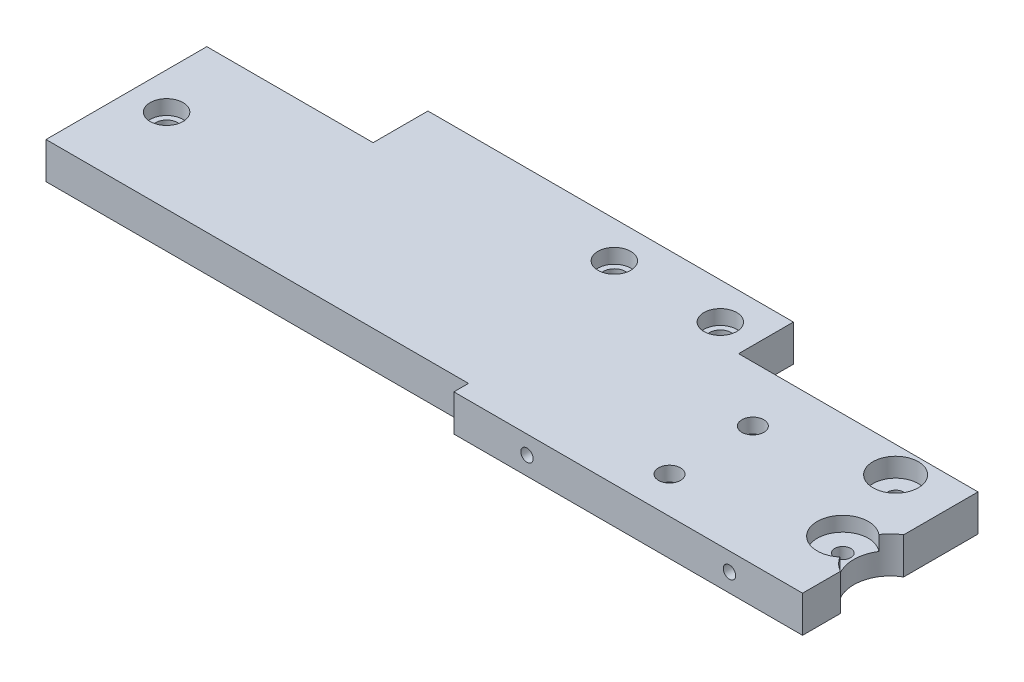
ISO-10303-21;
HEADER;
FILE_DESCRIPTION(('STEP AP214'),'2;1');
FILE_NAME('part.step','',(''),(''),'','','');
FILE_SCHEMA(('AUTOMOTIVE_DESIGN { 1 0 10303 214 1 1 1 1 }'));
ENDSEC;
DATA;
#1=APPLICATION_CONTEXT('core data for automotive mechanical design processes');
#2=APPLICATION_PROTOCOL_DEFINITION('international standard','automotive_design',2000,#1);
#3=PRODUCT_CONTEXT('',#1,'mechanical');
#4=PRODUCT('Part','Part','',(#3));
#5=PRODUCT_RELATED_PRODUCT_CATEGORY('part','',(#4));
#6=PRODUCT_DEFINITION_FORMATION('','',#4);
#7=PRODUCT_DEFINITION_CONTEXT('part definition',#1,'design');
#8=PRODUCT_DEFINITION('design','',#6,#7);
#9=PRODUCT_DEFINITION_SHAPE('','',#8);
#10=(LENGTH_UNIT() NAMED_UNIT(*) SI_UNIT(.MILLI.,.METRE.));
#11=(NAMED_UNIT(*) PLANE_ANGLE_UNIT() SI_UNIT($,.RADIAN.));
#12=(NAMED_UNIT(*) SI_UNIT($,.STERADIAN.) SOLID_ANGLE_UNIT());
#13=UNCERTAINTY_MEASURE_WITH_UNIT(LENGTH_MEASURE(1.E-05),#10,'distance_accuracy_value','');
#14=(GEOMETRIC_REPRESENTATION_CONTEXT(3) GLOBAL_UNCERTAINTY_ASSIGNED_CONTEXT((#13)) GLOBAL_UNIT_ASSIGNED_CONTEXT((#10,
#11,#12)) REPRESENTATION_CONTEXT('',''));
#15=CARTESIAN_POINT('',(0.,0.,0.));
#16=DIRECTION('',(0.,0.,1.));
#17=DIRECTION('',(1.,0.,0.));
#18=AXIS2_PLACEMENT_3D('',#15,#16,#17);
#19=CARTESIAN_POINT('',(28.75,0.,22.));
#20=DIRECTION('',(0.,1.,0.));
#21=DIRECTION('',(0.,0.,1.));
#22=AXIS2_PLACEMENT_3D('',#19,#20,#21);
#23=CYLINDRICAL_SURFACE('',#22,1.1);
#24=CARTESIAN_POINT('',(28.75,0.,22.));
#25=DIRECTION('',(0.,1.,0.));
#26=DIRECTION('',(0.,0.,1.));
#27=AXIS2_PLACEMENT_3D('',#24,#25,#26);
#28=CIRCLE('',#27,1.1);
#29=CARTESIAN_POINT('',(28.75,0.,23.1));
#30=VERTEX_POINT('',#29);
#31=EDGE_CURVE('E282',#30,#30,#28,.T.);
#32=ORIENTED_EDGE('',*,*,#31,.F.);
#33=EDGE_LOOP('',(#32));
#34=FACE_BOUND('',#33,.T.);
#35=CARTESIAN_POINT('',(28.75,3.,22.));
#36=DIRECTION('',(0.,1.,0.));
#37=DIRECTION('',(0.,0.,1.));
#38=AXIS2_PLACEMENT_3D('',#35,#36,#37);
#39=CIRCLE('',#38,1.1);
#40=CARTESIAN_POINT('',(28.75,3.,23.1));
#41=VERTEX_POINT('',#40);
#42=EDGE_CURVE('E232',#41,#41,#39,.F.);
#43=ORIENTED_EDGE('',*,*,#42,.F.);
#44=EDGE_LOOP('',(#43));
#45=FACE_BOUND('',#44,.T.);
#46=ADVANCED_FACE('F111',(#34,#45),#23,.F.);
#47=CARTESIAN_POINT('',(32.75,5.,7.5));
#48=DIRECTION('',(1.,0.,0.));
#49=DIRECTION('',(0.,0.,-1.));
#50=AXIS2_PLACEMENT_3D('',#47,#48,#49);
#51=PLANE('',#50);
#52=DIRECTION('',(0.,0.,1.));
#53=VECTOR('',#52,1.);
#54=CARTESIAN_POINT('',(32.75,0.,7.5));
#55=LINE('',#54,#53);
#56=CARTESIAN_POINT('',(32.75,0.,26.3301270189222));
#57=VERTEX_POINT('',#56);
#58=CARTESIAN_POINT('',(32.75,0.,31.5));
#59=VERTEX_POINT('',#58);
#60=EDGE_CURVE('E328',#57,#59,#55,.T.);
#61=ORIENTED_EDGE('',*,*,#60,.F.);
#62=DIRECTION('',(0.,-1.,0.));
#63=VECTOR('',#62,1.);
#64=CARTESIAN_POINT('',(32.75,5.,26.3301270189222));
#65=LINE('',#64,#63);
#66=CARTESIAN_POINT('',(32.75,5.,26.3301270189222));
#67=VERTEX_POINT('',#66);
#68=EDGE_CURVE('E403',#57,#67,#65,.F.);
#69=ORIENTED_EDGE('',*,*,#68,.T.);
#70=DIRECTION('',(0.,0.,1.));
#71=VECTOR('',#70,1.);
#72=CARTESIAN_POINT('',(32.75,5.,7.5));
#73=LINE('',#72,#71);
#74=CARTESIAN_POINT('',(32.75,5.,31.5));
#75=VERTEX_POINT('',#74);
#76=EDGE_CURVE('E228',#67,#75,#73,.T.);
#77=ORIENTED_EDGE('',*,*,#76,.T.);
#78=DIRECTION('',(0.,1.,0.));
#79=VECTOR('',#78,1.);
#80=CARTESIAN_POINT('',(32.75,5.,31.5));
#81=LINE('',#80,#79);
#82=EDGE_CURVE('E248',#59,#75,#81,.T.);
#83=ORIENTED_EDGE('',*,*,#82,.F.);
#84=EDGE_LOOP('',(#61,#69,#77,#83));
#85=FACE_BOUND('',#84,.T.);
#86=ADVANCED_FACE('F113',(#85),#51,.T.);
#87=CARTESIAN_POINT('',(32.75,5.,7.5));
#88=VERTEX_POINT('',#87);
#89=CARTESIAN_POINT('',(32.75,5.,17.6698729810778));
#90=VERTEX_POINT('',#89);
#91=EDGE_CURVE('E376',#88,#90,#73,.T.);
#92=ORIENTED_EDGE('',*,*,#91,.T.);
#93=DIRECTION('',(0.,-1.,0.));
#94=VECTOR('',#93,1.);
#95=CARTESIAN_POINT('',(32.75,5.,17.6698729810778));
#96=LINE('',#95,#94);
#97=CARTESIAN_POINT('',(32.75,0.,17.6698729810778));
#98=VERTEX_POINT('',#97);
#99=EDGE_CURVE('E354',#90,#98,#96,.T.);
#100=ORIENTED_EDGE('',*,*,#99,.T.);
#101=CARTESIAN_POINT('',(32.75,0.,7.5));
#102=VERTEX_POINT('',#101);
#103=EDGE_CURVE('E381',#102,#98,#55,.T.);
#104=ORIENTED_EDGE('',*,*,#103,.F.);
#105=DIRECTION('',(0.,-1.,0.));
#106=VECTOR('',#105,1.);
#107=CARTESIAN_POINT('',(32.75,5.,7.5));
#108=LINE('',#107,#106);
#109=EDGE_CURVE('E367',#88,#102,#108,.T.);
#110=ORIENTED_EDGE('',*,*,#109,.F.);
#111=EDGE_LOOP('',(#92,#100,#104,#110));
#112=FACE_BOUND('',#111,.T.);
#113=ADVANCED_FACE('F417',(#112),#51,.T.);
#114=CARTESIAN_POINT('',(0.,5.,29.5));
#115=DIRECTION('',(0.,0.,-1.));
#116=DIRECTION('',(-1.,0.,0.));
#117=AXIS2_PLACEMENT_3D('',#114,#115,#116);
#118=PLANE('',#117);
#119=DIRECTION('',(0.,-1.,0.));
#120=VECTOR('',#119,1.);
#121=CARTESIAN_POINT('',(-14.951964886511,5.,29.5));
#122=LINE('',#121,#120);
#123=CARTESIAN_POINT('',(-14.951964886511,5.,29.5));
#124=VERTEX_POINT('',#123);
#125=CARTESIAN_POINT('',(-14.951964886511,0.,29.5));
#126=VERTEX_POINT('',#125);
#127=EDGE_CURVE('E239',#124,#126,#122,.T.);
#128=ORIENTED_EDGE('',*,*,#127,.F.);
#129=DIRECTION('',(1.,0.,0.));
#130=VECTOR('',#129,1.);
#131=CARTESIAN_POINT('',(0.,5.,29.5));
#132=LINE('',#131,#130);
#133=CARTESIAN_POINT('',(-72.75,5.,29.5));
#134=VERTEX_POINT('',#133);
#135=EDGE_CURVE('E332',#134,#124,#132,.T.);
#136=ORIENTED_EDGE('',*,*,#135,.F.);
#137=DIRECTION('',(0.,-1.,0.));
#138=VECTOR('',#137,1.);
#139=CARTESIAN_POINT('',(-72.75,5.,29.5));
#140=LINE('',#139,#138);
#141=CARTESIAN_POINT('',(-72.75,0.,29.5));
#142=VERTEX_POINT('',#141);
#143=EDGE_CURVE('E351',#134,#142,#140,.T.);
#144=ORIENTED_EDGE('',*,*,#143,.T.);
#145=DIRECTION('',(1.,0.,0.));
#146=VECTOR('',#145,1.);
#147=CARTESIAN_POINT('',(0.,0.,29.5));
#148=LINE('',#147,#146);
#149=EDGE_CURVE('E343',#142,#126,#148,.T.);
#150=ORIENTED_EDGE('',*,*,#149,.T.);
#151=EDGE_LOOP('',(#128,#136,#144,#150));
#152=FACE_BOUND('',#151,.T.);
#153=ADVANCED_FACE('F450',(#152),#118,.F.);
#154=CARTESIAN_POINT('',(-19.5,5.,5.));
#155=DIRECTION('',(0.,-1.,0.));
#156=DIRECTION('',(0.,0.,-1.));
#157=AXIS2_PLACEMENT_3D('',#154,#155,#156);
#158=CYLINDRICAL_SURFACE('',#157,1.5);
#159=CARTESIAN_POINT('',(-19.5,0.,5.));
#160=DIRECTION('',(0.,1.,0.));
#161=DIRECTION('',(0.,0.,1.));
#162=AXIS2_PLACEMENT_3D('',#159,#160,#161);
#163=CIRCLE('',#162,1.5);
#164=CARTESIAN_POINT('',(-19.5,0.,6.5));
#165=VERTEX_POINT('',#164);
#166=EDGE_CURVE('E321',#165,#165,#163,.T.);
#167=ORIENTED_EDGE('',*,*,#166,.F.);
#168=EDGE_LOOP('',(#167));
#169=FACE_BOUND('',#168,.T.);
#170=CARTESIAN_POINT('',(-19.5,3.,5.));
#171=DIRECTION('',(0.,1.,0.));
#172=DIRECTION('',(0.,0.,1.));
#173=AXIS2_PLACEMENT_3D('',#170,#171,#172);
#174=CIRCLE('',#173,1.5);
#175=CARTESIAN_POINT('',(-19.5,3.,6.5));
#176=VERTEX_POINT('',#175);
#177=EDGE_CURVE('E325',#176,#176,#174,.T.);
#178=ORIENTED_EDGE('',*,*,#177,.T.);
#179=EDGE_LOOP('',(#178));
#180=FACE_BOUND('',#179,.T.);
#181=ADVANCED_FACE('F452',(#169,#180),#158,.F.);
#182=CARTESIAN_POINT('',(-5.,5.,5.));
#183=DIRECTION('',(0.,-1.,0.));
#184=DIRECTION('',(0.,0.,-1.));
#185=AXIS2_PLACEMENT_3D('',#182,#183,#184);
#186=CYLINDRICAL_SURFACE('',#185,1.5);
#187=CARTESIAN_POINT('',(-5.,0.,5.));
#188=DIRECTION('',(0.,1.,0.));
#189=DIRECTION('',(0.,0.,1.));
#190=AXIS2_PLACEMENT_3D('',#187,#188,#189);
#191=CIRCLE('',#190,1.5);
#192=CARTESIAN_POINT('',(-5.,0.,6.5));
#193=VERTEX_POINT('',#192);
#194=EDGE_CURVE('E318',#193,#193,#191,.T.);
#195=ORIENTED_EDGE('',*,*,#194,.F.);
#196=EDGE_LOOP('',(#195));
#197=FACE_BOUND('',#196,.T.);
#198=CARTESIAN_POINT('',(-5.,3.,5.));
#199=DIRECTION('',(0.,1.,0.));
#200=DIRECTION('',(0.,0.,1.));
#201=AXIS2_PLACEMENT_3D('',#198,#199,#200);
#202=CIRCLE('',#201,1.5);
#203=CARTESIAN_POINT('',(-5.,3.,6.5));
#204=VERTEX_POINT('',#203);
#205=EDGE_CURVE('E391',#204,#204,#202,.T.);
#206=ORIENTED_EDGE('',*,*,#205,.T.);
#207=EDGE_LOOP('',(#206));
#208=FACE_BOUND('',#207,.T.);
#209=ADVANCED_FACE('F458',(#197,#208),#186,.F.);
#210=CARTESIAN_POINT('',(-67.75,5.,18.));
#211=DIRECTION('',(0.,-1.,0.));
#212=DIRECTION('',(0.,0.,-1.));
#213=AXIS2_PLACEMENT_3D('',#210,#211,#212);
#214=CYLINDRICAL_SURFACE('',#213,1.5);
#215=CARTESIAN_POINT('',(-67.75,0.,18.));
#216=DIRECTION('',(0.,1.,0.));
#217=DIRECTION('',(0.,0.,1.));
#218=AXIS2_PLACEMENT_3D('',#215,#216,#217);
#219=CIRCLE('',#218,1.5);
#220=CARTESIAN_POINT('',(-67.75,0.,19.5));
#221=VERTEX_POINT('',#220);
#222=EDGE_CURVE('E322',#221,#221,#219,.T.);
#223=ORIENTED_EDGE('',*,*,#222,.F.);
#224=EDGE_LOOP('',(#223));
#225=FACE_BOUND('',#224,.T.);
#226=CARTESIAN_POINT('',(-67.75,3.,18.));
#227=DIRECTION('',(0.,1.,0.));
#228=DIRECTION('',(0.,0.,1.));
#229=AXIS2_PLACEMENT_3D('',#226,#227,#228);
#230=CIRCLE('',#229,1.5);
#231=CARTESIAN_POINT('',(-67.75,3.,19.5));
#232=VERTEX_POINT('',#231);
#233=EDGE_CURVE('E315',#232,#232,#230,.T.);
#234=ORIENTED_EDGE('',*,*,#233,.T.);
#235=EDGE_LOOP('',(#234));
#236=FACE_BOUND('',#235,.T.);
#237=ADVANCED_FACE('F510',(#225,#236),#214,.F.);
#238=CARTESIAN_POINT('',(0.,0.,0.));
#239=DIRECTION('',(0.,1.,0.));
#240=DIRECTION('',(0.,0.,1.));
#241=AXIS2_PLACEMENT_3D('',#238,#239,#240);
#242=PLANE('',#241);
#243=CARTESIAN_POINT('',(35.25,0.,22.));
#244=DIRECTION('',(0.,1.,0.));
#245=DIRECTION('',(0.,0.,1.));
#246=AXIS2_PLACEMENT_3D('',#243,#244,#245);
#247=CIRCLE('',#246,5.);
#248=EDGE_CURVE('E133',#98,#57,#247,.T.);
#249=ORIENTED_EDGE('',*,*,#248,.T.);
#250=ORIENTED_EDGE('',*,*,#60,.T.);
#251=DIRECTION('',(1.,0.,0.));
#252=VECTOR('',#251,1.);
#253=CARTESIAN_POINT('',(32.75,0.,31.5));
#254=LINE('',#253,#252);
#255=CARTESIAN_POINT('',(-14.951964886511,0.,31.5));
#256=VERTEX_POINT('',#255);
#257=EDGE_CURVE('E255',#256,#59,#254,.T.);
#258=ORIENTED_EDGE('',*,*,#257,.F.);
#259=DIRECTION('',(0.,0.,-1.));
#260=VECTOR('',#259,1.);
#261=CARTESIAN_POINT('',(-14.951964886511,0.,31.5));
#262=LINE('',#261,#260);
#263=EDGE_CURVE('E258',#256,#126,#262,.T.);
#264=ORIENTED_EDGE('',*,*,#263,.T.);
#265=ORIENTED_EDGE('',*,*,#149,.F.);
#266=DIRECTION('',(0.,0.,1.));
#267=VECTOR('',#266,1.);
#268=CARTESIAN_POINT('',(-72.75,0.,0.));
#269=LINE('',#268,#267);
#270=CARTESIAN_POINT('',(-72.75,0.,7.5));
#271=VERTEX_POINT('',#270);
#272=EDGE_CURVE('E340',#271,#142,#269,.T.);
#273=ORIENTED_EDGE('',*,*,#272,.F.);
#274=DIRECTION('',(1.,0.,0.));
#275=VECTOR('',#274,1.);
#276=CARTESIAN_POINT('',(0.,0.,7.5));
#277=LINE('',#276,#275);
#278=CARTESIAN_POINT('',(-50.,0.,7.5));
#279=VERTEX_POINT('',#278);
#280=EDGE_CURVE('E333',#271,#279,#277,.T.);
#281=ORIENTED_EDGE('',*,*,#280,.T.);
#282=DIRECTION('',(0.,0.,-1.));
#283=VECTOR('',#282,1.);
#284=CARTESIAN_POINT('',(-50.,0.,29.5));
#285=LINE('',#284,#283);
#286=CARTESIAN_POINT('',(-50.,0.,0.));
#287=VERTEX_POINT('',#286);
#288=EDGE_CURVE('E364',#279,#287,#285,.T.);
#289=ORIENTED_EDGE('',*,*,#288,.T.);
#290=DIRECTION('',(1.,0.,0.));
#291=VECTOR('',#290,1.);
#292=CARTESIAN_POINT('',(-50.,0.,0.));
#293=LINE('',#292,#291);
#294=CARTESIAN_POINT('',(0.,0.,0.));
#295=VERTEX_POINT('',#294);
#296=EDGE_CURVE('E366',#287,#295,#293,.T.);
#297=ORIENTED_EDGE('',*,*,#296,.T.);
#298=DIRECTION('',(0.,0.,-1.));
#299=VECTOR('',#298,1.);
#300=CARTESIAN_POINT('',(0.,0.,29.5));
#301=LINE('',#300,#299);
#302=CARTESIAN_POINT('',(0.,0.,7.5));
#303=VERTEX_POINT('',#302);
#304=EDGE_CURVE('E358',#303,#295,#301,.T.);
#305=ORIENTED_EDGE('',*,*,#304,.F.);
#306=DIRECTION('',(1.,0.,0.));
#307=VECTOR('',#306,1.);
#308=CARTESIAN_POINT('',(-72.75,0.,7.5));
#309=LINE('',#308,#307);
#310=EDGE_CURVE('E384',#303,#102,#309,.T.);
#311=ORIENTED_EDGE('',*,*,#310,.T.);
#312=ORIENTED_EDGE('',*,*,#103,.T.);
#313=EDGE_LOOP('',(#249,#250,#258,#264,#265,#273,#281,#289,#297,#305,#311,#312));
#314=FACE_BOUND('',#313,.T.);
#315=CARTESIAN_POINT('',(9.54803511348903,0.,26.5000000000005));
#316=DIRECTION('',(0.,-1.,0.));
#317=DIRECTION('',(0.,0.,-1.));
#318=AXIS2_PLACEMENT_3D('',#315,#316,#317);
#319=CIRCLE('',#318,2.25);
#320=CARTESIAN_POINT('',(9.54803511348903,0.,24.2500000000005));
#321=VERTEX_POINT('',#320);
#322=EDGE_CURVE('E267',#321,#321,#319,.T.);
#323=ORIENTED_EDGE('',*,*,#322,.F.);
#324=EDGE_LOOP('',(#323));
#325=FACE_BOUND('',#324,.T.);
#326=CARTESIAN_POINT('',(9.54803511348903,0.,15.1000000000005));
#327=DIRECTION('',(0.,-1.,0.));
#328=DIRECTION('',(0.,0.,-1.));
#329=AXIS2_PLACEMENT_3D('',#326,#327,#328);
#330=CIRCLE('',#329,2.25);
#331=CARTESIAN_POINT('',(9.54803511348903,0.,12.8500000000005));
#332=VERTEX_POINT('',#331);
#333=EDGE_CURVE('E271',#332,#332,#330,.T.);
#334=ORIENTED_EDGE('',*,*,#333,.F.);
#335=EDGE_LOOP('',(#334));
#336=FACE_BOUND('',#335,.T.);
#337=CARTESIAN_POINT('',(25.0839394440354,0.,11.1));
#338=DIRECTION('',(0.,1.,0.));
#339=DIRECTION('',(0.,0.,1.));
#340=AXIS2_PLACEMENT_3D('',#337,#338,#339);
#341=CIRCLE('',#340,1.1);
#342=CARTESIAN_POINT('',(25.0839394440354,0.,12.2));
#343=VERTEX_POINT('',#342);
#344=EDGE_CURVE('E287',#343,#343,#341,.T.);
#345=ORIENTED_EDGE('',*,*,#344,.T.);
#346=EDGE_LOOP('',(#345));
#347=FACE_BOUND('',#346,.T.);
#348=ORIENTED_EDGE('',*,*,#31,.T.);
#349=EDGE_LOOP('',(#348));
#350=FACE_BOUND('',#349,.T.);
#351=ORIENTED_EDGE('',*,*,#222,.T.);
#352=EDGE_LOOP('',(#351));
#353=FACE_BOUND('',#352,.T.);
#354=ORIENTED_EDGE('',*,*,#194,.T.);
#355=EDGE_LOOP('',(#354));
#356=FACE_BOUND('',#355,.T.);
#357=ORIENTED_EDGE('',*,*,#166,.T.);
#358=EDGE_LOOP('',(#357));
#359=FACE_BOUND('',#358,.T.);
#360=ADVANCED_FACE('F409',(#314,#325,#336,#347,#350,#353,#356,#359),#242,.F.);
#361=CARTESIAN_POINT('',(0.,5.,7.5));
#362=DIRECTION('',(0.,0.,-1.));
#363=DIRECTION('',(-1.,0.,0.));
#364=AXIS2_PLACEMENT_3D('',#361,#362,#363);
#365=PLANE('',#364);
#366=ORIENTED_EDGE('',*,*,#280,.F.);
#367=DIRECTION('',(0.,-1.,0.));
#368=VECTOR('',#367,1.);
#369=CARTESIAN_POINT('',(-72.75,5.,7.5));
#370=LINE('',#369,#368);
#371=CARTESIAN_POINT('',(-72.75,5.,7.5));
#372=VERTEX_POINT('',#371);
#373=EDGE_CURVE('E339',#372,#271,#370,.T.);
#374=ORIENTED_EDGE('',*,*,#373,.F.);
#375=DIRECTION('',(1.,0.,0.));
#376=VECTOR('',#375,1.);
#377=CARTESIAN_POINT('',(0.,5.,7.5));
#378=LINE('',#377,#376);
#379=CARTESIAN_POINT('',(-50.,5.,7.5));
#380=VERTEX_POINT('',#379);
#381=EDGE_CURVE('E336',#372,#380,#378,.T.);
#382=ORIENTED_EDGE('',*,*,#381,.T.);
#383=DIRECTION('',(0.,-1.,0.));
#384=VECTOR('',#383,1.);
#385=CARTESIAN_POINT('',(-50.,5.,7.5));
#386=LINE('',#385,#384);
#387=EDGE_CURVE('E349',#380,#279,#386,.T.);
#388=ORIENTED_EDGE('',*,*,#387,.T.);
#389=EDGE_LOOP('',(#366,#374,#382,#388));
#390=FACE_BOUND('',#389,.T.);
#391=ADVANCED_FACE('F435',(#390),#365,.T.);
#392=CARTESIAN_POINT('',(-72.75,5.,0.));
#393=DIRECTION('',(1.,0.,0.));
#394=DIRECTION('',(0.,0.,-1.));
#395=AXIS2_PLACEMENT_3D('',#392,#393,#394);
#396=PLANE('',#395);
#397=ORIENTED_EDGE('',*,*,#272,.T.);
#398=ORIENTED_EDGE('',*,*,#143,.F.);
#399=DIRECTION('',(0.,0.,1.));
#400=VECTOR('',#399,1.);
#401=CARTESIAN_POINT('',(-72.75,5.,0.));
#402=LINE('',#401,#400);
#403=EDGE_CURVE('E329',#372,#134,#402,.T.);
#404=ORIENTED_EDGE('',*,*,#403,.F.);
#405=ORIENTED_EDGE('',*,*,#373,.T.);
#406=EDGE_LOOP('',(#397,#398,#404,#405));
#407=FACE_BOUND('',#406,.T.);
#408=ADVANCED_FACE('F441',(#407),#396,.F.);
#409=CARTESIAN_POINT('',(0.,5.,0.));
#410=DIRECTION('',(0.,1.,0.));
#411=DIRECTION('',(0.,0.,1.));
#412=AXIS2_PLACEMENT_3D('',#409,#410,#411);
#413=PLANE('',#412);
#414=CARTESIAN_POINT('',(28.75,5.,22.));
#415=DIRECTION('',(0.,1.,0.));
#416=DIRECTION('',(0.,0.,1.));
#417=AXIS2_PLACEMENT_3D('',#414,#415,#416);
#418=CIRCLE('',#417,3.5);
#419=CARTESIAN_POINT('',(31.0192307692308,5.,19.335306449894));
#420=VERTEX_POINT('',#419);
#421=CARTESIAN_POINT('',(31.0192307692308,5.,24.664693550106));
#422=VERTEX_POINT('',#421);
#423=EDGE_CURVE('E210',#420,#422,#418,.T.);
#424=ORIENTED_EDGE('',*,*,#423,.F.);
#425=CARTESIAN_POINT('',(35.25,5.,22.));
#426=DIRECTION('',(0.,1.,0.));
#427=DIRECTION('',(0.,0.,1.));
#428=AXIS2_PLACEMENT_3D('',#425,#426,#427);
#429=CIRCLE('',#428,5.);
#430=EDGE_CURVE('E229',#90,#420,#429,.T.);
#431=ORIENTED_EDGE('',*,*,#430,.F.);
#432=ORIENTED_EDGE('',*,*,#91,.F.);
#433=DIRECTION('',(1.,0.,0.));
#434=VECTOR('',#433,1.);
#435=CARTESIAN_POINT('',(-72.75,5.,7.5));
#436=LINE('',#435,#434);
#437=CARTESIAN_POINT('',(0.,5.,7.5));
#438=VERTEX_POINT('',#437);
#439=EDGE_CURVE('E379',#438,#88,#436,.T.);
#440=ORIENTED_EDGE('',*,*,#439,.F.);
#441=DIRECTION('',(0.,0.,-1.));
#442=VECTOR('',#441,1.);
#443=CARTESIAN_POINT('',(0.,5.,29.5));
#444=LINE('',#443,#442);
#445=CARTESIAN_POINT('',(0.,5.,0.));
#446=VERTEX_POINT('',#445);
#447=EDGE_CURVE('E361',#438,#446,#444,.T.);
#448=ORIENTED_EDGE('',*,*,#447,.T.);
#449=DIRECTION('',(1.,0.,0.));
#450=VECTOR('',#449,1.);
#451=CARTESIAN_POINT('',(-50.,5.,0.));
#452=LINE('',#451,#450);
#453=CARTESIAN_POINT('',(-50.,5.,0.));
#454=VERTEX_POINT('',#453);
#455=EDGE_CURVE('E357',#454,#446,#452,.T.);
#456=ORIENTED_EDGE('',*,*,#455,.F.);
#457=DIRECTION('',(0.,0.,-1.));
#458=VECTOR('',#457,1.);
#459=CARTESIAN_POINT('',(-50.,5.,29.5));
#460=LINE('',#459,#458);
#461=EDGE_CURVE('E355',#380,#454,#460,.T.);
#462=ORIENTED_EDGE('',*,*,#461,.F.);
#463=ORIENTED_EDGE('',*,*,#381,.F.);
#464=ORIENTED_EDGE('',*,*,#403,.T.);
#465=ORIENTED_EDGE('',*,*,#135,.T.);
#466=DIRECTION('',(0.,0.,-1.));
#467=VECTOR('',#466,1.);
#468=CARTESIAN_POINT('',(-14.951964886511,5.,31.5));
#469=LINE('',#468,#467);
#470=CARTESIAN_POINT('',(-14.951964886511,5.,31.5));
#471=VERTEX_POINT('',#470);
#472=EDGE_CURVE('E263',#471,#124,#469,.T.);
#473=ORIENTED_EDGE('',*,*,#472,.F.);
#474=DIRECTION('',(-1.,0.,0.));
#475=VECTOR('',#474,1.);
#476=CARTESIAN_POINT('',(32.75,5.,31.5));
#477=LINE('',#476,#475);
#478=EDGE_CURVE('E251',#75,#471,#477,.T.);
#479=ORIENTED_EDGE('',*,*,#478,.F.);
#480=ORIENTED_EDGE('',*,*,#76,.F.);
#481=EDGE_CURVE('E221',#422,#67,#429,.T.);
#482=ORIENTED_EDGE('',*,*,#481,.F.);
#483=EDGE_LOOP('',(#424,#431,#432,#440,#448,#456,#462,#463,#464,#465,#473,#479,#480,#482));
#484=FACE_BOUND('',#483,.T.);
#485=CARTESIAN_POINT('',(9.54803511348903,5.,15.1000000000005));
#486=DIRECTION('',(0.,-1.,0.));
#487=DIRECTION('',(0.,0.,-1.));
#488=AXIS2_PLACEMENT_3D('',#485,#486,#487);
#489=CIRCLE('',#488,1.5);
#490=CARTESIAN_POINT('',(9.54803511348903,5.,13.6000000000005));
#491=VERTEX_POINT('',#490);
#492=EDGE_CURVE('E279',#491,#491,#489,.T.);
#493=ORIENTED_EDGE('',*,*,#492,.T.);
#494=EDGE_LOOP('',(#493));
#495=FACE_BOUND('',#494,.T.);
#496=CARTESIAN_POINT('',(9.54803511348903,5.,26.5000000000005));
#497=DIRECTION('',(0.,-1.,0.));
#498=DIRECTION('',(0.,0.,-1.));
#499=AXIS2_PLACEMENT_3D('',#496,#497,#498);
#500=CIRCLE('',#499,1.5);
#501=CARTESIAN_POINT('',(9.54803511348903,5.,25.0000000000005));
#502=VERTEX_POINT('',#501);
#503=EDGE_CURVE('E283',#502,#502,#500,.T.);
#504=ORIENTED_EDGE('',*,*,#503,.T.);
#505=EDGE_LOOP('',(#504));
#506=FACE_BOUND('',#505,.T.);
#507=CARTESIAN_POINT('',(25.0839394440354,5.,11.1));
#508=DIRECTION('',(0.,1.,0.));
#509=DIRECTION('',(0.,0.,1.));
#510=AXIS2_PLACEMENT_3D('',#507,#508,#509);
#511=CIRCLE('',#510,3.1);
#512=CARTESIAN_POINT('',(25.0839394440354,5.,14.2));
#513=VERTEX_POINT('',#512);
#514=EDGE_CURVE('E297',#513,#513,#511,.T.);
#515=ORIENTED_EDGE('',*,*,#514,.F.);
#516=EDGE_LOOP('',(#515));
#517=FACE_BOUND('',#516,.T.);
#518=CARTESIAN_POINT('',(-67.75,5.,18.));
#519=DIRECTION('',(0.,1.,0.));
#520=DIRECTION('',(0.,0.,1.));
#521=AXIS2_PLACEMENT_3D('',#518,#519,#520);
#522=CIRCLE('',#521,2.25);
#523=CARTESIAN_POINT('',(-67.75,5.,20.25));
#524=VERTEX_POINT('',#523);
#525=EDGE_CURVE('E307',#524,#524,#522,.T.);
#526=ORIENTED_EDGE('',*,*,#525,.F.);
#527=EDGE_LOOP('',(#526));
#528=FACE_BOUND('',#527,.T.);
#529=CARTESIAN_POINT('',(-5.,5.,5.));
#530=DIRECTION('',(0.,1.,0.));
#531=DIRECTION('',(0.,0.,1.));
#532=AXIS2_PLACEMENT_3D('',#529,#530,#531);
#533=CIRCLE('',#532,2.25);
#534=CARTESIAN_POINT('',(-5.,5.,7.25));
#535=VERTEX_POINT('',#534);
#536=EDGE_CURVE('E300',#535,#535,#533,.T.);
#537=ORIENTED_EDGE('',*,*,#536,.F.);
#538=EDGE_LOOP('',(#537));
#539=FACE_BOUND('',#538,.T.);
#540=CARTESIAN_POINT('',(-19.5,5.,5.));
#541=DIRECTION('',(0.,1.,0.));
#542=DIRECTION('',(0.,0.,1.));
#543=AXIS2_PLACEMENT_3D('',#540,#541,#542);
#544=CIRCLE('',#543,2.25);
#545=CARTESIAN_POINT('',(-19.5,5.,7.25));
#546=VERTEX_POINT('',#545);
#547=EDGE_CURVE('E303',#546,#546,#544,.T.);
#548=ORIENTED_EDGE('',*,*,#547,.F.);
#549=EDGE_LOOP('',(#548));
#550=FACE_BOUND('',#549,.T.);
#551=ADVANCED_FACE('F225',(#484,#495,#506,#517,#528,#539,#550),#413,.T.);
#552=CARTESIAN_POINT('',(-72.75,5.,7.5));
#553=DIRECTION('',(0.,0.,-1.));
#554=DIRECTION('',(-1.,0.,0.));
#555=AXIS2_PLACEMENT_3D('',#552,#553,#554);
#556=PLANE('',#555);
#557=DIRECTION('',(0.,-1.,0.));
#558=VECTOR('',#557,1.);
#559=CARTESIAN_POINT('',(0.,5.,7.5));
#560=LINE('',#559,#558);
#561=EDGE_CURVE('E344',#438,#303,#560,.T.);
#562=ORIENTED_EDGE('',*,*,#561,.F.);
#563=ORIENTED_EDGE('',*,*,#439,.T.);
#564=ORIENTED_EDGE('',*,*,#109,.T.);
#565=ORIENTED_EDGE('',*,*,#310,.F.);
#566=EDGE_LOOP('',(#562,#563,#564,#565));
#567=FACE_BOUND('',#566,.T.);
#568=ADVANCED_FACE('F517',(#567),#556,.T.);
#569=CARTESIAN_POINT('',(0.,5.,29.5));
#570=DIRECTION('',(-1.,0.,0.));
#571=DIRECTION('',(0.,0.,1.));
#572=AXIS2_PLACEMENT_3D('',#569,#570,#571);
#573=PLANE('',#572);
#574=ORIENTED_EDGE('',*,*,#447,.F.);
#575=ORIENTED_EDGE('',*,*,#561,.T.);
#576=ORIENTED_EDGE('',*,*,#304,.T.);
#577=DIRECTION('',(0.,-1.,0.));
#578=VECTOR('',#577,1.);
#579=CARTESIAN_POINT('',(0.,5.,0.));
#580=LINE('',#579,#578);
#581=EDGE_CURVE('E371',#446,#295,#580,.T.);
#582=ORIENTED_EDGE('',*,*,#581,.F.);
#583=EDGE_LOOP('',(#574,#575,#576,#582));
#584=FACE_BOUND('',#583,.T.);
#585=ADVANCED_FACE('F425',(#584),#573,.F.);
#586=CARTESIAN_POINT('',(-50.,5.,0.));
#587=DIRECTION('',(0.,0.,-1.));
#588=DIRECTION('',(-1.,0.,0.));
#589=AXIS2_PLACEMENT_3D('',#586,#587,#588);
#590=PLANE('',#589);
#591=ORIENTED_EDGE('',*,*,#296,.F.);
#592=DIRECTION('',(0.,-1.,0.));
#593=VECTOR('',#592,1.);
#594=CARTESIAN_POINT('',(-50.,5.,0.));
#595=LINE('',#594,#593);
#596=EDGE_CURVE('E363',#454,#287,#595,.T.);
#597=ORIENTED_EDGE('',*,*,#596,.F.);
#598=ORIENTED_EDGE('',*,*,#455,.T.);
#599=ORIENTED_EDGE('',*,*,#581,.T.);
#600=EDGE_LOOP('',(#591,#597,#598,#599));
#601=FACE_BOUND('',#600,.T.);
#602=ADVANCED_FACE('F429',(#601),#590,.T.);
#603=CARTESIAN_POINT('',(-50.,5.,29.5));
#604=DIRECTION('',(-1.,0.,0.));
#605=DIRECTION('',(0.,0.,1.));
#606=AXIS2_PLACEMENT_3D('',#603,#604,#605);
#607=PLANE('',#606);
#608=ORIENTED_EDGE('',*,*,#387,.F.);
#609=ORIENTED_EDGE('',*,*,#461,.T.);
#610=ORIENTED_EDGE('',*,*,#596,.T.);
#611=ORIENTED_EDGE('',*,*,#288,.F.);
#612=EDGE_LOOP('',(#608,#609,#610,#611));
#613=FACE_BOUND('',#612,.T.);
#614=ADVANCED_FACE('F497',(#613),#607,.T.);
#615=CARTESIAN_POINT('',(-67.75,3.,18.));
#616=DIRECTION('',(0.,1.,0.));
#617=DIRECTION('',(0.,0.,1.));
#618=AXIS2_PLACEMENT_3D('',#615,#616,#617);
#619=CYLINDRICAL_SURFACE('',#618,2.25);
#620=CARTESIAN_POINT('',(-67.75,3.,18.));
#621=DIRECTION('',(0.,1.,0.));
#622=DIRECTION('',(0.,0.,1.));
#623=AXIS2_PLACEMENT_3D('',#620,#621,#622);
#624=CIRCLE('',#623,2.25);
#625=CARTESIAN_POINT('',(-67.75,3.,20.25));
#626=VERTEX_POINT('',#625);
#627=EDGE_CURVE('E296',#626,#626,#624,.T.);
#628=ORIENTED_EDGE('',*,*,#627,.F.);
#629=EDGE_LOOP('',(#628));
#630=FACE_BOUND('',#629,.T.);
#631=ORIENTED_EDGE('',*,*,#525,.T.);
#632=EDGE_LOOP('',(#631));
#633=FACE_BOUND('',#632,.T.);
#634=ADVANCED_FACE('F494',(#630,#633),#619,.F.);
#635=CARTESIAN_POINT('',(-67.75,3.,18.));
#636=DIRECTION('',(0.,1.,0.));
#637=DIRECTION('',(0.,0.,1.));
#638=AXIS2_PLACEMENT_3D('',#635,#636,#637);
#639=PLANE('',#638);
#640=ORIENTED_EDGE('',*,*,#233,.F.);
#641=EDGE_LOOP('',(#640));
#642=FACE_BOUND('',#641,.T.);
#643=ORIENTED_EDGE('',*,*,#627,.T.);
#644=EDGE_LOOP('',(#643));
#645=FACE_BOUND('',#644,.T.);
#646=ADVANCED_FACE('F488',(#642,#645),#639,.T.);
#647=CARTESIAN_POINT('',(-5.,3.,5.));
#648=DIRECTION('',(0.,1.,0.));
#649=DIRECTION('',(0.,0.,1.));
#650=AXIS2_PLACEMENT_3D('',#647,#648,#649);
#651=CYLINDRICAL_SURFACE('',#650,2.25);
#652=CARTESIAN_POINT('',(-5.,3.,5.));
#653=DIRECTION('',(0.,1.,0.));
#654=DIRECTION('',(0.,0.,1.));
#655=AXIS2_PLACEMENT_3D('',#652,#653,#654);
#656=CIRCLE('',#655,2.25);
#657=CARTESIAN_POINT('',(-5.,3.,7.25));
#658=VERTEX_POINT('',#657);
#659=EDGE_CURVE('E304',#658,#658,#656,.T.);
#660=ORIENTED_EDGE('',*,*,#659,.F.);
#661=EDGE_LOOP('',(#660));
#662=FACE_BOUND('',#661,.T.);
#663=ORIENTED_EDGE('',*,*,#536,.T.);
#664=EDGE_LOOP('',(#663));
#665=FACE_BOUND('',#664,.T.);
#666=ADVANCED_FACE('F484',(#662,#665),#651,.F.);
#667=CARTESIAN_POINT('',(-5.,3.,5.));
#668=DIRECTION('',(0.,1.,0.));
#669=DIRECTION('',(0.,0.,1.));
#670=AXIS2_PLACEMENT_3D('',#667,#668,#669);
#671=PLANE('',#670);
#672=ORIENTED_EDGE('',*,*,#205,.F.);
#673=EDGE_LOOP('',(#672));
#674=FACE_BOUND('',#673,.T.);
#675=ORIENTED_EDGE('',*,*,#659,.T.);
#676=EDGE_LOOP('',(#675));
#677=FACE_BOUND('',#676,.T.);
#678=ADVANCED_FACE('F487',(#674,#677),#671,.T.);
#679=CARTESIAN_POINT('',(-19.5,3.,5.));
#680=DIRECTION('',(0.,1.,0.));
#681=DIRECTION('',(0.,0.,1.));
#682=AXIS2_PLACEMENT_3D('',#679,#680,#681);
#683=CYLINDRICAL_SURFACE('',#682,2.25);
#684=CARTESIAN_POINT('',(-19.5,3.,5.));
#685=DIRECTION('',(0.,1.,0.));
#686=DIRECTION('',(0.,0.,1.));
#687=AXIS2_PLACEMENT_3D('',#684,#685,#686);
#688=CIRCLE('',#687,2.25);
#689=CARTESIAN_POINT('',(-19.5,3.,7.25));
#690=VERTEX_POINT('',#689);
#691=EDGE_CURVE('E312',#690,#690,#688,.T.);
#692=ORIENTED_EDGE('',*,*,#691,.F.);
#693=EDGE_LOOP('',(#692));
#694=FACE_BOUND('',#693,.T.);
#695=ORIENTED_EDGE('',*,*,#547,.T.);
#696=EDGE_LOOP('',(#695));
#697=FACE_BOUND('',#696,.T.);
#698=ADVANCED_FACE('F492',(#694,#697),#683,.F.);
#699=CARTESIAN_POINT('',(-19.5,3.,5.));
#700=DIRECTION('',(0.,1.,0.));
#701=DIRECTION('',(0.,0.,1.));
#702=AXIS2_PLACEMENT_3D('',#699,#700,#701);
#703=PLANE('',#702);
#704=ORIENTED_EDGE('',*,*,#177,.F.);
#705=EDGE_LOOP('',(#704));
#706=FACE_BOUND('',#705,.T.);
#707=ORIENTED_EDGE('',*,*,#691,.T.);
#708=EDGE_LOOP('',(#707));
#709=FACE_BOUND('',#708,.T.);
#710=ADVANCED_FACE('F482',(#706,#709),#703,.T.);
#711=CARTESIAN_POINT('',(25.0839394440354,2.4,11.1));
#712=DIRECTION('',(0.,1.,0.));
#713=DIRECTION('',(0.,0.,1.));
#714=AXIS2_PLACEMENT_3D('',#711,#712,#713);
#715=CYLINDRICAL_SURFACE('',#714,3.1);
#716=CARTESIAN_POINT('',(25.0839394440354,2.4,11.1));
#717=DIRECTION('',(0.,1.,0.));
#718=DIRECTION('',(0.,0.,1.));
#719=AXIS2_PLACEMENT_3D('',#716,#717,#718);
#720=CIRCLE('',#719,3.1);
#721=CARTESIAN_POINT('',(25.0839394440354,2.4,14.2));
#722=VERTEX_POINT('',#721);
#723=EDGE_CURVE('E293',#722,#722,#720,.T.);
#724=ORIENTED_EDGE('',*,*,#723,.F.);
#725=EDGE_LOOP('',(#724));
#726=FACE_BOUND('',#725,.T.);
#727=ORIENTED_EDGE('',*,*,#514,.T.);
#728=EDGE_LOOP('',(#727));
#729=FACE_BOUND('',#728,.T.);
#730=ADVANCED_FACE('F478',(#726,#729),#715,.F.);
#731=CARTESIAN_POINT('',(25.0839394440354,2.4,11.1));
#732=DIRECTION('',(0.,1.,0.));
#733=DIRECTION('',(0.,0.,1.));
#734=AXIS2_PLACEMENT_3D('',#731,#732,#733);
#735=PLANE('',#734);
#736=CARTESIAN_POINT('',(25.0839394440354,2.4,11.1));
#737=DIRECTION('',(0.,1.,0.));
#738=DIRECTION('',(0.,0.,1.));
#739=AXIS2_PLACEMENT_3D('',#736,#737,#738);
#740=CIRCLE('',#739,1.1);
#741=CARTESIAN_POINT('',(25.0839394440354,2.4,12.2));
#742=VERTEX_POINT('',#741);
#743=EDGE_CURVE('E290',#742,#742,#740,.T.);
#744=ORIENTED_EDGE('',*,*,#743,.F.);
#745=EDGE_LOOP('',(#744));
#746=FACE_BOUND('',#745,.T.);
#747=ORIENTED_EDGE('',*,*,#723,.T.);
#748=EDGE_LOOP('',(#747));
#749=FACE_BOUND('',#748,.T.);
#750=ADVANCED_FACE('F475',(#746,#749),#735,.T.);
#751=CARTESIAN_POINT('',(25.0839394440354,0.,11.1));
#752=DIRECTION('',(0.,1.,0.));
#753=DIRECTION('',(0.,0.,1.));
#754=AXIS2_PLACEMENT_3D('',#751,#752,#753);
#755=CYLINDRICAL_SURFACE('',#754,1.1);
#756=ORIENTED_EDGE('',*,*,#743,.T.);
#757=EDGE_LOOP('',(#756));
#758=FACE_BOUND('',#757,.T.);
#759=ORIENTED_EDGE('',*,*,#344,.F.);
#760=EDGE_LOOP('',(#759));
#761=FACE_BOUND('',#760,.T.);
#762=ADVANCED_FACE('F473',(#758,#761),#755,.F.);
#763=CARTESIAN_POINT('',(9.54803511348903,5.,26.5000000000005));
#764=DIRECTION('',(0.,-1.,0.));
#765=DIRECTION('',(0.,0.,-1.));
#766=AXIS2_PLACEMENT_3D('',#763,#764,#765);
#767=CYLINDRICAL_SURFACE('',#766,1.5);
#768=CARTESIAN_POINT('',(9.54803511348903,3.,26.5000000000005));
#769=DIRECTION('',(0.,1.,0.));
#770=DIRECTION('',(0.,0.,1.));
#771=AXIS2_PLACEMENT_3D('',#768,#769,#770);
#772=CIRCLE('',#771,1.5);
#773=CARTESIAN_POINT('',(9.54803511348903,3.,28.0000000000005));
#774=VERTEX_POINT('',#773);
#775=EDGE_CURVE('E286',#774,#774,#772,.F.);
#776=ORIENTED_EDGE('',*,*,#775,.T.);
#777=EDGE_LOOP('',(#776));
#778=FACE_BOUND('',#777,.T.);
#779=ORIENTED_EDGE('',*,*,#503,.F.);
#780=EDGE_LOOP('',(#779));
#781=FACE_BOUND('',#780,.T.);
#782=ADVANCED_FACE('F619',(#778,#781),#767,.F.);
#783=CARTESIAN_POINT('',(9.54803511348903,5.,15.1000000000005));
#784=DIRECTION('',(0.,-1.,0.));
#785=DIRECTION('',(0.,0.,-1.));
#786=AXIS2_PLACEMENT_3D('',#783,#784,#785);
#787=CYLINDRICAL_SURFACE('',#786,1.5);
#788=CARTESIAN_POINT('',(9.54803511348903,3.,15.1000000000005));
#789=DIRECTION('',(0.,1.,0.));
#790=DIRECTION('',(0.,0.,1.));
#791=AXIS2_PLACEMENT_3D('',#788,#789,#790);
#792=CIRCLE('',#791,1.5);
#793=CARTESIAN_POINT('',(9.54803511348903,3.,16.6000000000005));
#794=VERTEX_POINT('',#793);
#795=EDGE_CURVE('E274',#794,#794,#792,.F.);
#796=ORIENTED_EDGE('',*,*,#795,.T.);
#797=EDGE_LOOP('',(#796));
#798=FACE_BOUND('',#797,.T.);
#799=ORIENTED_EDGE('',*,*,#492,.F.);
#800=EDGE_LOOP('',(#799));
#801=FACE_BOUND('',#800,.T.);
#802=ADVANCED_FACE('F628',(#798,#801),#787,.F.);
#803=CARTESIAN_POINT('',(0.,3.,0.));
#804=DIRECTION('',(0.,1.,0.));
#805=DIRECTION('',(0.,0.,1.));
#806=AXIS2_PLACEMENT_3D('',#803,#804,#805);
#807=PLANE('',#806);
#808=CARTESIAN_POINT('',(9.54803511348903,3.,15.1000000000005));
#809=DIRECTION('',(0.,1.,0.));
#810=DIRECTION('',(0.,0.,1.));
#811=AXIS2_PLACEMENT_3D('',#808,#809,#810);
#812=CIRCLE('',#811,2.25);
#813=CARTESIAN_POINT('',(9.54803511348903,3.,17.3500000000005));
#814=VERTEX_POINT('',#813);
#815=EDGE_CURVE('E266',#814,#814,#812,.F.);
#816=ORIENTED_EDGE('',*,*,#815,.T.);
#817=EDGE_LOOP('',(#816));
#818=FACE_BOUND('',#817,.T.);
#819=ORIENTED_EDGE('',*,*,#795,.F.);
#820=EDGE_LOOP('',(#819));
#821=FACE_BOUND('',#820,.T.);
#822=ADVANCED_FACE('F637',(#818,#821),#807,.F.);
#823=CARTESIAN_POINT('',(9.54803511348903,11.3639610306789,15.1000000000005));
#824=DIRECTION('',(0.,-1.,0.));
#825=DIRECTION('',(0.,0.,-1.));
#826=AXIS2_PLACEMENT_3D('',#823,#824,#825);
#827=CYLINDRICAL_SURFACE('',#826,2.25);
#828=ORIENTED_EDGE('',*,*,#333,.T.);
#829=EDGE_LOOP('',(#828));
#830=FACE_BOUND('',#829,.T.);
#831=ORIENTED_EDGE('',*,*,#815,.F.);
#832=EDGE_LOOP('',(#831));
#833=FACE_BOUND('',#832,.T.);
#834=ADVANCED_FACE('F647',(#830,#833),#827,.F.);
#835=CARTESIAN_POINT('',(0.,3.,0.));
#836=DIRECTION('',(0.,1.,0.));
#837=DIRECTION('',(0.,0.,1.));
#838=AXIS2_PLACEMENT_3D('',#835,#836,#837);
#839=PLANE('',#838);
#840=CARTESIAN_POINT('',(9.54803511348903,3.,26.5000000000005));
#841=DIRECTION('',(0.,1.,0.));
#842=DIRECTION('',(0.,0.,1.));
#843=AXIS2_PLACEMENT_3D('',#840,#841,#842);
#844=CIRCLE('',#843,2.25);
#845=CARTESIAN_POINT('',(9.54803511348903,3.,28.7500000000005));
#846=VERTEX_POINT('',#845);
#847=EDGE_CURVE('E270',#846,#846,#844,.F.);
#848=ORIENTED_EDGE('',*,*,#847,.T.);
#849=EDGE_LOOP('',(#848));
#850=FACE_BOUND('',#849,.T.);
#851=ORIENTED_EDGE('',*,*,#775,.F.);
#852=EDGE_LOOP('',(#851));
#853=FACE_BOUND('',#852,.T.);
#854=ADVANCED_FACE('F657',(#850,#853),#839,.F.);
#855=CARTESIAN_POINT('',(9.54803511348903,11.3639610306789,26.5000000000005));
#856=DIRECTION('',(0.,-1.,0.));
#857=DIRECTION('',(0.,0.,-1.));
#858=AXIS2_PLACEMENT_3D('',#855,#856,#857);
#859=CYLINDRICAL_SURFACE('',#858,2.25);
#860=ORIENTED_EDGE('',*,*,#322,.T.);
#861=EDGE_LOOP('',(#860));
#862=FACE_BOUND('',#861,.T.);
#863=ORIENTED_EDGE('',*,*,#847,.F.);
#864=EDGE_LOOP('',(#863));
#865=FACE_BOUND('',#864,.T.);
#866=ADVANCED_FACE('F667',(#862,#865),#859,.F.);
#867=CARTESIAN_POINT('',(-14.951964886511,5.,31.5));
#868=DIRECTION('',(1.,0.,0.));
#869=DIRECTION('',(0.,0.,-1.));
#870=AXIS2_PLACEMENT_3D('',#867,#868,#869);
#871=PLANE('',#870);
#872=ORIENTED_EDGE('',*,*,#127,.T.);
#873=ORIENTED_EDGE('',*,*,#263,.F.);
#874=DIRECTION('',(0.,-1.,0.));
#875=VECTOR('',#874,1.);
#876=CARTESIAN_POINT('',(-14.951964886511,5.,31.5));
#877=LINE('',#876,#875);
#878=EDGE_CURVE('E253',#471,#256,#877,.T.);
#879=ORIENTED_EDGE('',*,*,#878,.F.);
#880=ORIENTED_EDGE('',*,*,#472,.T.);
#881=EDGE_LOOP('',(#872,#873,#879,#880));
#882=FACE_BOUND('',#881,.T.);
#883=ADVANCED_FACE('F446',(#882),#871,.F.);
#884=CARTESIAN_POINT('',(0.,0.,31.5));
#885=DIRECTION('',(0.,0.,-1.));
#886=DIRECTION('',(-1.,0.,0.));
#887=AXIS2_PLACEMENT_3D('',#884,#885,#886);
#888=PLANE('',#887);
#889=CARTESIAN_POINT('',(-4.95196488651095,2.5,31.5));
#890=DIRECTION('',(0.,0.,1.));
#891=DIRECTION('',(1.,0.,0.));
#892=AXIS2_PLACEMENT_3D('',#889,#890,#891);
#893=CIRCLE('',#892,0.85);
#894=CARTESIAN_POINT('',(-4.10196488651095,2.5,31.5));
#895=VERTEX_POINT('',#894);
#896=EDGE_CURVE('E240',#895,#895,#893,.T.);
#897=ORIENTED_EDGE('',*,*,#896,.F.);
#898=EDGE_LOOP('',(#897));
#899=FACE_BOUND('',#898,.T.);
#900=CARTESIAN_POINT('',(22.75,2.5,31.5));
#901=DIRECTION('',(0.,0.,1.));
#902=DIRECTION('',(1.,0.,0.));
#903=AXIS2_PLACEMENT_3D('',#900,#901,#902);
#904=CIRCLE('',#903,0.85);
#905=CARTESIAN_POINT('',(23.6,2.5,31.5));
#906=VERTEX_POINT('',#905);
#907=EDGE_CURVE('E243',#906,#906,#904,.T.);
#908=ORIENTED_EDGE('',*,*,#907,.F.);
#909=EDGE_LOOP('',(#908));
#910=FACE_BOUND('',#909,.T.);
#911=ORIENTED_EDGE('',*,*,#82,.T.);
#912=ORIENTED_EDGE('',*,*,#478,.T.);
#913=ORIENTED_EDGE('',*,*,#878,.T.);
#914=ORIENTED_EDGE('',*,*,#257,.T.);
#915=EDGE_LOOP('',(#911,#912,#913,#914));
#916=FACE_BOUND('',#915,.T.);
#917=ADVANCED_FACE('F449',(#899,#910,#916),#888,.F.);
#918=CARTESIAN_POINT('',(22.75,2.5,27.5));
#919=DIRECTION('',(0.,0.,1.));
#920=DIRECTION('',(1.,0.,0.));
#921=AXIS2_PLACEMENT_3D('',#918,#919,#920);
#922=CYLINDRICAL_SURFACE('',#921,0.85);
#923=CARTESIAN_POINT('',(22.75,2.5,27.5));
#924=DIRECTION('',(0.,0.,1.));
#925=DIRECTION('',(1.,0.,0.));
#926=AXIS2_PLACEMENT_3D('',#923,#924,#925);
#927=CIRCLE('',#926,0.85);
#928=CARTESIAN_POINT('',(23.6,2.5,27.5));
#929=VERTEX_POINT('',#928);
#930=EDGE_CURVE('E231',#929,#929,#927,.T.);
#931=ORIENTED_EDGE('',*,*,#930,.F.);
#932=EDGE_LOOP('',(#931));
#933=FACE_BOUND('',#932,.T.);
#934=ORIENTED_EDGE('',*,*,#907,.T.);
#935=EDGE_LOOP('',(#934));
#936=FACE_BOUND('',#935,.T.);
#937=ADVANCED_FACE('F702',(#933,#936),#922,.F.);
#938=CARTESIAN_POINT('',(22.75,2.5,27.5));
#939=DIRECTION('',(0.,0.,1.));
#940=DIRECTION('',(1.,0.,0.));
#941=AXIS2_PLACEMENT_3D('',#938,#939,#940);
#942=PLANE('',#941);
#943=ORIENTED_EDGE('',*,*,#930,.T.);
#944=EDGE_LOOP('',(#943));
#945=FACE_BOUND('',#944,.T.);
#946=ADVANCED_FACE('F712',(#945),#942,.T.);
#947=CARTESIAN_POINT('',(-4.95196488651095,2.5,27.5));
#948=DIRECTION('',(0.,0.,1.));
#949=DIRECTION('',(1.,0.,0.));
#950=AXIS2_PLACEMENT_3D('',#947,#948,#949);
#951=CYLINDRICAL_SURFACE('',#950,0.85);
#952=CARTESIAN_POINT('',(-4.95196488651095,2.5,27.5));
#953=DIRECTION('',(0.,0.,1.));
#954=DIRECTION('',(1.,0.,0.));
#955=AXIS2_PLACEMENT_3D('',#952,#953,#954);
#956=CIRCLE('',#955,0.85);
#957=CARTESIAN_POINT('',(-4.10196488651095,2.5,27.5));
#958=VERTEX_POINT('',#957);
#959=EDGE_CURVE('E236',#958,#958,#956,.T.);
#960=ORIENTED_EDGE('',*,*,#959,.F.);
#961=EDGE_LOOP('',(#960));
#962=FACE_BOUND('',#961,.T.);
#963=ORIENTED_EDGE('',*,*,#896,.T.);
#964=EDGE_LOOP('',(#963));
#965=FACE_BOUND('',#964,.T.);
#966=ADVANCED_FACE('F722',(#962,#965),#951,.F.);
#967=CARTESIAN_POINT('',(-4.95196488651095,2.5,27.5));
#968=DIRECTION('',(0.,0.,1.));
#969=DIRECTION('',(1.,0.,0.));
#970=AXIS2_PLACEMENT_3D('',#967,#968,#969);
#971=PLANE('',#970);
#972=ORIENTED_EDGE('',*,*,#959,.T.);
#973=EDGE_LOOP('',(#972));
#974=FACE_BOUND('',#973,.T.);
#975=ADVANCED_FACE('F732',(#974),#971,.T.);
#976=CARTESIAN_POINT('',(35.25,5.,22.));
#977=DIRECTION('',(0.,-1.,0.));
#978=DIRECTION('',(0.,0.,-1.));
#979=AXIS2_PLACEMENT_3D('',#976,#977,#978);
#980=CYLINDRICAL_SURFACE('',#979,5.);
#981=DIRECTION('',(0.,1.,0.));
#982=VECTOR('',#981,1.);
#983=CARTESIAN_POINT('',(31.0192307692308,4.,19.335306449894));
#984=LINE('',#983,#982);
#985=CARTESIAN_POINT('',(31.0192307692308,3.,19.335306449894));
#986=VERTEX_POINT('',#985);
#987=EDGE_CURVE('E13',#986,#420,#984,.T.);
#988=ORIENTED_EDGE('',*,*,#987,.F.);
#989=CARTESIAN_POINT('',(35.25,3.,22.));
#990=DIRECTION('',(0.,1.,0.));
#991=DIRECTION('',(0.,0.,1.));
#992=AXIS2_PLACEMENT_3D('',#989,#990,#991);
#993=CIRCLE('',#992,5.);
#994=CARTESIAN_POINT('',(31.0192307692308,3.,24.664693550106));
#995=VERTEX_POINT('',#994);
#996=EDGE_CURVE('E223',#986,#995,#993,.T.);
#997=ORIENTED_EDGE('',*,*,#996,.T.);
#998=DIRECTION('',(0.,1.,0.));
#999=VECTOR('',#998,1.);
#1000=CARTESIAN_POINT('',(31.0192307692308,4.,24.664693550106));
#1001=LINE('',#1000,#999);
#1002=EDGE_CURVE('E119',#422,#995,#1001,.F.);
#1003=ORIENTED_EDGE('',*,*,#1002,.F.);
#1004=ORIENTED_EDGE('',*,*,#481,.T.);
#1005=ORIENTED_EDGE('',*,*,#68,.F.);
#1006=ORIENTED_EDGE('',*,*,#248,.F.);
#1007=ORIENTED_EDGE('',*,*,#99,.F.);
#1008=ORIENTED_EDGE('',*,*,#430,.T.);
#1009=EDGE_LOOP('',(#988,#997,#1003,#1004,#1005,#1006,#1007,#1008));
#1010=FACE_BOUND('',#1009,.T.);
#1011=ADVANCED_FACE('F220',(#1010),#980,.F.);
#1012=CARTESIAN_POINT('',(28.75,3.,22.));
#1013=DIRECTION('',(0.,1.,0.));
#1014=DIRECTION('',(0.,0.,1.));
#1015=AXIS2_PLACEMENT_3D('',#1012,#1013,#1014);
#1016=PLANE('',#1015);
#1017=CARTESIAN_POINT('',(28.75,3.,22.));
#1018=DIRECTION('',(0.,1.,0.));
#1019=DIRECTION('',(0.,0.,1.));
#1020=AXIS2_PLACEMENT_3D('',#1017,#1018,#1019);
#1021=CIRCLE('',#1020,3.5);
#1022=EDGE_CURVE('E125',#986,#995,#1021,.T.);
#1023=ORIENTED_EDGE('',*,*,#1022,.T.);
#1024=ORIENTED_EDGE('',*,*,#996,.F.);
#1025=EDGE_LOOP('',(#1023,#1024));
#1026=FACE_BOUND('',#1025,.T.);
#1027=ORIENTED_EDGE('',*,*,#42,.T.);
#1028=EDGE_LOOP('',(#1027));
#1029=FACE_BOUND('',#1028,.T.);
#1030=ADVANCED_FACE('F782',(#1026,#1029),#1016,.T.);
#1031=CARTESIAN_POINT('',(28.75,3.,22.));
#1032=DIRECTION('',(0.,1.,0.));
#1033=DIRECTION('',(0.,0.,1.));
#1034=AXIS2_PLACEMENT_3D('',#1031,#1032,#1033);
#1035=CYLINDRICAL_SURFACE('',#1034,3.5);
#1036=ORIENTED_EDGE('',*,*,#987,.T.);
#1037=ORIENTED_EDGE('',*,*,#423,.T.);
#1038=ORIENTED_EDGE('',*,*,#1002,.T.);
#1039=ORIENTED_EDGE('',*,*,#1022,.F.);
#1040=EDGE_LOOP('',(#1036,#1037,#1038,#1039));
#1041=FACE_BOUND('',#1040,.T.);
#1042=ADVANCED_FACE('F212',(#1041),#1035,.F.);
#1043=CLOSED_SHELL('',(#46,#86,#113,#153,#181,#209,#237,#360,#391,#408,#551,#568,#585,#602,#614,
#634,#646,#666,#678,#698,#710,#730,#750,#762,#782,#802,#822,#834,#854,#866,#883,#917,#937,#946,
#966,#975,#1011,#1030,#1042));
#1044=MANIFOLD_SOLID_BREP('B2',#1043);
#1045=ADVANCED_BREP_SHAPE_REPRESENTATION('',(#18,#1044),#14);
#1046=SHAPE_DEFINITION_REPRESENTATION(#9,#1045);
ENDSEC;
END-ISO-10303-21;
